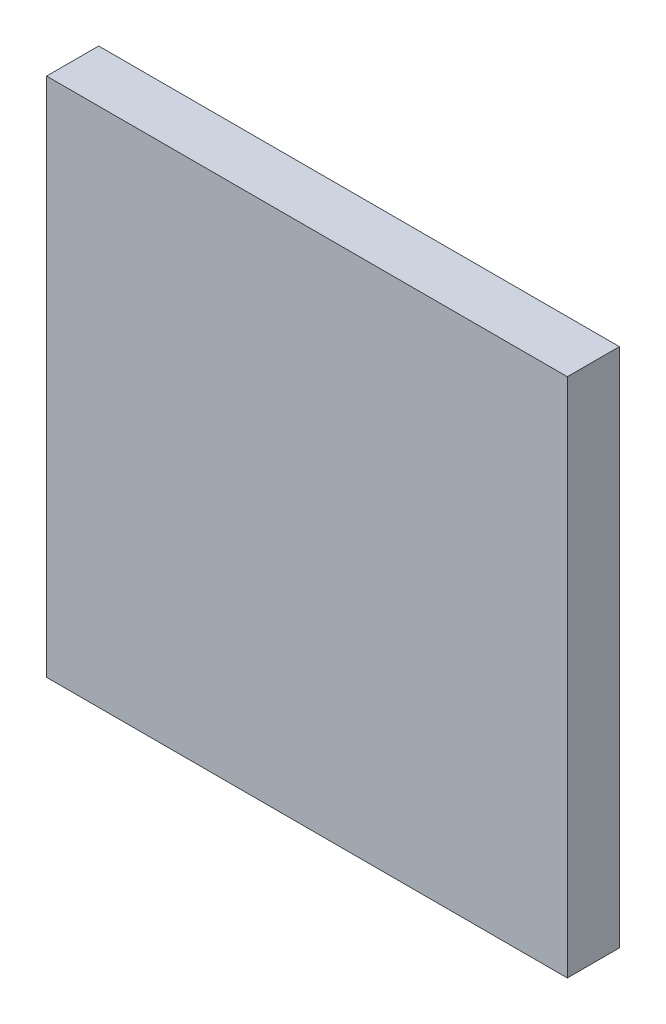
ISO-10303-21;
HEADER;
FILE_DESCRIPTION(('STEP AP214'),'2;1');
FILE_NAME('part.step','',(''),(''),'','','');
FILE_SCHEMA(('AUTOMOTIVE_DESIGN { 1 0 10303 214 1 1 1 1 }'));
ENDSEC;
DATA;
#1=APPLICATION_CONTEXT('core data for automotive mechanical design processes');
#2=APPLICATION_PROTOCOL_DEFINITION('international standard','automotive_design',2000,#1);
#3=PRODUCT_CONTEXT('',#1,'mechanical');
#4=PRODUCT('Part','Part','',(#3));
#5=PRODUCT_RELATED_PRODUCT_CATEGORY('part','',(#4));
#6=PRODUCT_DEFINITION_FORMATION('','',#4);
#7=PRODUCT_DEFINITION_CONTEXT('part definition',#1,'design');
#8=PRODUCT_DEFINITION('design','',#6,#7);
#9=PRODUCT_DEFINITION_SHAPE('','',#8);
#10=(LENGTH_UNIT() NAMED_UNIT(*) SI_UNIT(.MILLI.,.METRE.));
#11=(NAMED_UNIT(*) PLANE_ANGLE_UNIT() SI_UNIT($,.RADIAN.));
#12=(NAMED_UNIT(*) SI_UNIT($,.STERADIAN.) SOLID_ANGLE_UNIT());
#13=UNCERTAINTY_MEASURE_WITH_UNIT(LENGTH_MEASURE(1.E-05),#10,'distance_accuracy_value','');
#14=(GEOMETRIC_REPRESENTATION_CONTEXT(3) GLOBAL_UNCERTAINTY_ASSIGNED_CONTEXT((#13)) GLOBAL_UNIT_ASSIGNED_CONTEXT((#10,
#11,#12)) REPRESENTATION_CONTEXT('',''));
#15=CARTESIAN_POINT('',(0.,0.,0.));
#16=DIRECTION('',(0.,0.,1.));
#17=DIRECTION('',(1.,0.,0.));
#18=AXIS2_PLACEMENT_3D('',#15,#16,#17);
#19=CARTESIAN_POINT('',(-20.,-20.,4.));
#20=DIRECTION('',(1.,0.,0.));
#21=DIRECTION('',(0.,0.,-1.));
#22=AXIS2_PLACEMENT_3D('',#19,#20,#21);
#23=PLANE('',#22);
#24=DIRECTION('',(0.,-1.,0.));
#25=VECTOR('',#24,1.);
#26=CARTESIAN_POINT('',(-20.,-20.,0.));
#27=LINE('',#26,#25);
#28=CARTESIAN_POINT('',(-20.,20.,0.));
#29=VERTEX_POINT('',#28);
#30=CARTESIAN_POINT('',(-20.,-20.,0.));
#31=VERTEX_POINT('',#30);
#32=EDGE_CURVE('E104',#29,#31,#27,.T.);
#33=ORIENTED_EDGE('',*,*,#32,.T.);
#34=DIRECTION('',(0.,0.,-1.));
#35=VECTOR('',#34,1.);
#36=CARTESIAN_POINT('',(-20.,-20.,4.));
#37=LINE('',#36,#35);
#38=CARTESIAN_POINT('',(-20.,-20.,4.));
#39=VERTEX_POINT('',#38);
#40=EDGE_CURVE('E11',#39,#31,#37,.T.);
#41=ORIENTED_EDGE('',*,*,#40,.F.);
#42=DIRECTION('',(0.,-1.,0.));
#43=VECTOR('',#42,1.);
#44=CARTESIAN_POINT('',(-20.,-20.,4.));
#45=LINE('',#44,#43);
#46=CARTESIAN_POINT('',(-20.,20.,4.));
#47=VERTEX_POINT('',#46);
#48=EDGE_CURVE('E92',#47,#39,#45,.T.);
#49=ORIENTED_EDGE('',*,*,#48,.F.);
#50=DIRECTION('',(0.,0.,-1.));
#51=VECTOR('',#50,1.);
#52=CARTESIAN_POINT('',(-20.,20.,4.));
#53=LINE('',#52,#51);
#54=EDGE_CURVE('E100',#47,#29,#53,.T.);
#55=ORIENTED_EDGE('',*,*,#54,.T.);
#56=EDGE_LOOP('',(#33,#41,#49,#55));
#57=FACE_BOUND('',#56,.T.);
#58=ADVANCED_FACE('F41',(#57),#23,.F.);
#59=CARTESIAN_POINT('',(-20.,-20.,4.));
#60=DIRECTION('',(0.,1.,0.));
#61=DIRECTION('',(0.,0.,1.));
#62=AXIS2_PLACEMENT_3D('',#59,#60,#61);
#63=PLANE('',#62);
#64=DIRECTION('',(1.,0.,0.));
#65=VECTOR('',#64,1.);
#66=CARTESIAN_POINT('',(-20.,-20.,0.));
#67=LINE('',#66,#65);
#68=CARTESIAN_POINT('',(20.,-20.,0.));
#69=VERTEX_POINT('',#68);
#70=EDGE_CURVE('E96',#31,#69,#67,.T.);
#71=ORIENTED_EDGE('',*,*,#70,.T.);
#72=DIRECTION('',(0.,0.,-1.));
#73=VECTOR('',#72,1.);
#74=CARTESIAN_POINT('',(20.,-20.,4.));
#75=LINE('',#74,#73);
#76=CARTESIAN_POINT('',(20.,-20.,4.));
#77=VERTEX_POINT('',#76);
#78=EDGE_CURVE('E49',#77,#69,#75,.T.);
#79=ORIENTED_EDGE('',*,*,#78,.F.);
#80=DIRECTION('',(1.,0.,0.));
#81=VECTOR('',#80,1.);
#82=CARTESIAN_POINT('',(-20.,-20.,4.));
#83=LINE('',#82,#81);
#84=EDGE_CURVE('E87',#39,#77,#83,.T.);
#85=ORIENTED_EDGE('',*,*,#84,.F.);
#86=ORIENTED_EDGE('',*,*,#40,.T.);
#87=EDGE_LOOP('',(#71,#79,#85,#86));
#88=FACE_BOUND('',#87,.T.);
#89=ADVANCED_FACE('F95',(#88),#63,.F.);
#90=CARTESIAN_POINT('',(20.,-20.,4.));
#91=DIRECTION('',(-1.,0.,0.));
#92=DIRECTION('',(0.,0.,1.));
#93=AXIS2_PLACEMENT_3D('',#90,#91,#92);
#94=PLANE('',#93);
#95=DIRECTION('',(0.,1.,0.));
#96=VECTOR('',#95,1.);
#97=CARTESIAN_POINT('',(20.,-20.,0.));
#98=LINE('',#97,#96);
#99=CARTESIAN_POINT('',(20.,20.,0.));
#100=VERTEX_POINT('',#99);
#101=EDGE_CURVE('E74',#69,#100,#98,.T.);
#102=ORIENTED_EDGE('',*,*,#101,.T.);
#103=DIRECTION('',(0.,0.,-1.));
#104=VECTOR('',#103,1.);
#105=CARTESIAN_POINT('',(20.,20.,4.));
#106=LINE('',#105,#104);
#107=CARTESIAN_POINT('',(20.,20.,4.));
#108=VERTEX_POINT('',#107);
#109=EDGE_CURVE('E97',#108,#100,#106,.T.);
#110=ORIENTED_EDGE('',*,*,#109,.F.);
#111=DIRECTION('',(0.,1.,0.));
#112=VECTOR('',#111,1.);
#113=CARTESIAN_POINT('',(20.,-20.,4.));
#114=LINE('',#113,#112);
#115=EDGE_CURVE('E90',#77,#108,#114,.T.);
#116=ORIENTED_EDGE('',*,*,#115,.F.);
#117=ORIENTED_EDGE('',*,*,#78,.T.);
#118=EDGE_LOOP('',(#102,#110,#116,#117));
#119=FACE_BOUND('',#118,.T.);
#120=ADVANCED_FACE('F98',(#119),#94,.F.);
#121=CARTESIAN_POINT('',(-20.,20.,4.));
#122=DIRECTION('',(0.,-1.,0.));
#123=DIRECTION('',(0.,0.,-1.));
#124=AXIS2_PLACEMENT_3D('',#121,#122,#123);
#125=PLANE('',#124);
#126=DIRECTION('',(-1.,0.,0.));
#127=VECTOR('',#126,1.);
#128=CARTESIAN_POINT('',(-20.,20.,0.));
#129=LINE('',#128,#127);
#130=EDGE_CURVE('E80',#100,#29,#129,.T.);
#131=ORIENTED_EDGE('',*,*,#130,.T.);
#132=ORIENTED_EDGE('',*,*,#54,.F.);
#133=DIRECTION('',(-1.,0.,0.));
#134=VECTOR('',#133,1.);
#135=CARTESIAN_POINT('',(-20.,20.,4.));
#136=LINE('',#135,#134);
#137=EDGE_CURVE('E57',#108,#47,#136,.T.);
#138=ORIENTED_EDGE('',*,*,#137,.F.);
#139=ORIENTED_EDGE('',*,*,#109,.T.);
#140=EDGE_LOOP('',(#131,#132,#138,#139));
#141=FACE_BOUND('',#140,.T.);
#142=ADVANCED_FACE('F111',(#141),#125,.F.);
#143=CARTESIAN_POINT('',(0.,0.,4.));
#144=DIRECTION('',(0.,0.,-1.));
#145=DIRECTION('',(-1.,0.,0.));
#146=AXIS2_PLACEMENT_3D('',#143,#144,#145);
#147=PLANE('',#146);
#148=ORIENTED_EDGE('',*,*,#48,.T.);
#149=ORIENTED_EDGE('',*,*,#84,.T.);
#150=ORIENTED_EDGE('',*,*,#115,.T.);
#151=ORIENTED_EDGE('',*,*,#137,.T.);
#152=EDGE_LOOP('',(#148,#149,#150,#151));
#153=FACE_BOUND('',#152,.T.);
#154=ADVANCED_FACE('F88',(#153),#147,.F.);
#155=CARTESIAN_POINT('',(0.,0.,0.));
#156=DIRECTION('',(0.,0.,-1.));
#157=DIRECTION('',(-1.,0.,0.));
#158=AXIS2_PLACEMENT_3D('',#155,#156,#157);
#159=PLANE('',#158);
#160=ORIENTED_EDGE('',*,*,#32,.F.);
#161=ORIENTED_EDGE('',*,*,#130,.F.);
#162=ORIENTED_EDGE('',*,*,#101,.F.);
#163=ORIENTED_EDGE('',*,*,#70,.F.);
#164=EDGE_LOOP('',(#160,#161,#162,#163));
#165=FACE_BOUND('',#164,.T.);
#166=ADVANCED_FACE('F114',(#165),#159,.T.);
#167=CLOSED_SHELL('',(#58,#89,#120,#142,#154,#166));
#168=MANIFOLD_SOLID_BREP('B2',#167);
#169=ADVANCED_BREP_SHAPE_REPRESENTATION('',(#18,#168),#14);
#170=SHAPE_DEFINITION_REPRESENTATION(#9,#169);
ENDSEC;
END-ISO-10303-21;
